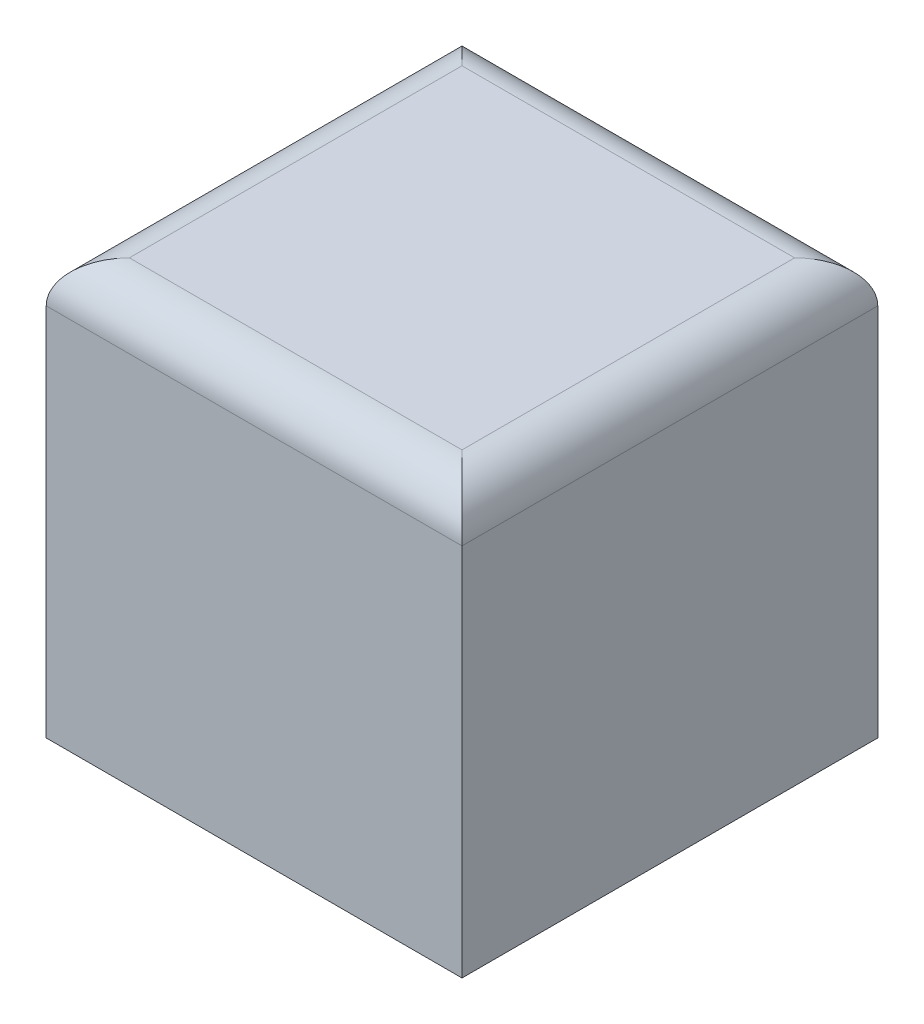
ISO-10303-21;
HEADER;
FILE_DESCRIPTION(('STEP AP214'),'2;1');
FILE_NAME('part.step','',(''),(''),'','','');
FILE_SCHEMA(('AUTOMOTIVE_DESIGN { 1 0 10303 214 1 1 1 1 }'));
ENDSEC;
DATA;
#1=APPLICATION_CONTEXT('core data for automotive mechanical design processes');
#2=APPLICATION_PROTOCOL_DEFINITION('international standard','automotive_design',2000,#1);
#3=PRODUCT_CONTEXT('',#1,'mechanical');
#4=PRODUCT('Part','Part','',(#3));
#5=PRODUCT_RELATED_PRODUCT_CATEGORY('part','',(#4));
#6=PRODUCT_DEFINITION_FORMATION('','',#4);
#7=PRODUCT_DEFINITION_CONTEXT('part definition',#1,'design');
#8=PRODUCT_DEFINITION('design','',#6,#7);
#9=PRODUCT_DEFINITION_SHAPE('','',#8);
#10=(LENGTH_UNIT() NAMED_UNIT(*) SI_UNIT(.MILLI.,.METRE.));
#11=(NAMED_UNIT(*) PLANE_ANGLE_UNIT() SI_UNIT($,.RADIAN.));
#12=(NAMED_UNIT(*) SI_UNIT($,.STERADIAN.) SOLID_ANGLE_UNIT());
#13=UNCERTAINTY_MEASURE_WITH_UNIT(LENGTH_MEASURE(1.E-05),#10,'distance_accuracy_value','');
#14=(GEOMETRIC_REPRESENTATION_CONTEXT(3) GLOBAL_UNCERTAINTY_ASSIGNED_CONTEXT((#13)) GLOBAL_UNIT_ASSIGNED_CONTEXT((#10,
#11,#12)) REPRESENTATION_CONTEXT('',''));
#15=CARTESIAN_POINT('',(0.,0.,0.));
#16=DIRECTION('',(0.,0.,1.));
#17=DIRECTION('',(1.,0.,0.));
#18=AXIS2_PLACEMENT_3D('',#15,#16,#17);
#19=CARTESIAN_POINT('',(-40.,40.,100.));
#20=DIRECTION('',(0.,0.,1.));
#21=DIRECTION('',(1.,0.,0.));
#22=AXIS2_PLACEMENT_3D('',#19,#20,#21);
#23=CYLINDRICAL_SURFACE('',#22,10.);
#24=CARTESIAN_POINT('',(-40.,40.,90.));
#25=DIRECTION('',(0.707106781186547,0.,0.707106781186547));
#26=DIRECTION('',(0.707106781186547,0.,-0.707106781186547));
#27=AXIS2_PLACEMENT_3D('',#24,#25,#26);
#28=ELLIPSE('',#27,14.1421356237309,10.);
#29=CARTESIAN_POINT('',(-40.,50.,90.));
#30=VERTEX_POINT('',#29);
#31=CARTESIAN_POINT('',(-50.,40.,100.));
#32=VERTEX_POINT('',#31);
#33=EDGE_CURVE('E11',#30,#32,#28,.T.);
#34=ORIENTED_EDGE('',*,*,#33,.F.);
#35=DIRECTION('',(0.,0.,1.));
#36=VECTOR('',#35,1.);
#37=CARTESIAN_POINT('',(-40.,50.,100.));
#38=LINE('',#37,#36);
#39=CARTESIAN_POINT('',(-40.,50.,10.));
#40=VERTEX_POINT('',#39);
#41=EDGE_CURVE('E112',#40,#30,#38,.T.);
#42=ORIENTED_EDGE('',*,*,#41,.F.);
#43=CARTESIAN_POINT('',(-40.,40.,9.99999999999999));
#44=DIRECTION('',(-0.707106781186547,0.,0.707106781186547));
#45=DIRECTION('',(0.707106781186547,0.,0.707106781186547));
#46=AXIS2_PLACEMENT_3D('',#43,#44,#45);
#47=ELLIPSE('',#46,14.1421356237309,10.);
#48=CARTESIAN_POINT('',(-50.,40.,0.));
#49=VERTEX_POINT('',#48);
#50=EDGE_CURVE('E48',#40,#49,#47,.T.);
#51=ORIENTED_EDGE('',*,*,#50,.T.);
#52=DIRECTION('',(0.,0.,1.));
#53=VECTOR('',#52,1.);
#54=CARTESIAN_POINT('',(-50.,40.,100.));
#55=LINE('',#54,#53);
#56=EDGE_CURVE('E145',#32,#49,#55,.F.);
#57=ORIENTED_EDGE('',*,*,#56,.F.);
#58=EDGE_LOOP('',(#34,#42,#51,#57));
#59=FACE_BOUND('',#58,.T.);
#60=ADVANCED_FACE('F41',(#59),#23,.T.);
#61=CARTESIAN_POINT('',(-50.,40.,9.99999999999999));
#62=DIRECTION('',(1.,0.,0.));
#63=DIRECTION('',(0.,0.,-1.));
#64=AXIS2_PLACEMENT_3D('',#61,#62,#63);
#65=CYLINDRICAL_SURFACE('',#64,10.);
#66=ORIENTED_EDGE('',*,*,#50,.F.);
#67=DIRECTION('',(-1.,0.,0.));
#68=VECTOR('',#67,1.);
#69=CARTESIAN_POINT('',(-50.,50.,9.99999999999999));
#70=LINE('',#69,#68);
#71=CARTESIAN_POINT('',(40.,50.,9.99999999999999));
#72=VERTEX_POINT('',#71);
#73=EDGE_CURVE('E130',#72,#40,#70,.T.);
#74=ORIENTED_EDGE('',*,*,#73,.F.);
#75=CARTESIAN_POINT('',(40.,40.,9.99999999999999));
#76=DIRECTION('',(0.707106781186547,0.,0.707106781186547));
#77=DIRECTION('',(0.707106781186547,0.,-0.707106781186547));
#78=AXIS2_PLACEMENT_3D('',#75,#76,#77);
#79=ELLIPSE('',#78,14.1421356237309,10.);
#80=CARTESIAN_POINT('',(50.,40.,0.));
#81=VERTEX_POINT('',#80);
#82=EDGE_CURVE('E62',#72,#81,#79,.F.);
#83=ORIENTED_EDGE('',*,*,#82,.T.);
#84=DIRECTION('',(-1.,0.,0.));
#85=VECTOR('',#84,1.);
#86=CARTESIAN_POINT('',(-50.,40.,0.));
#87=LINE('',#86,#85);
#88=EDGE_CURVE('E143',#49,#81,#87,.F.);
#89=ORIENTED_EDGE('',*,*,#88,.F.);
#90=EDGE_LOOP('',(#66,#74,#83,#89));
#91=FACE_BOUND('',#90,.T.);
#92=ADVANCED_FACE('F159',(#91),#65,.T.);
#93=CARTESIAN_POINT('',(40.,40.,100.));
#94=DIRECTION('',(0.,0.,-1.));
#95=DIRECTION('',(-1.,0.,0.));
#96=AXIS2_PLACEMENT_3D('',#93,#94,#95);
#97=CYLINDRICAL_SURFACE('',#96,10.);
#98=ORIENTED_EDGE('',*,*,#82,.F.);
#99=DIRECTION('',(0.,0.,-1.));
#100=VECTOR('',#99,1.);
#101=CARTESIAN_POINT('',(40.,50.,100.));
#102=LINE('',#101,#100);
#103=CARTESIAN_POINT('',(40.,50.,90.));
#104=VERTEX_POINT('',#103);
#105=EDGE_CURVE('E133',#104,#72,#102,.T.);
#106=ORIENTED_EDGE('',*,*,#105,.F.);
#107=CARTESIAN_POINT('',(40.,40.,90.));
#108=DIRECTION('',(0.707106781186547,0.,-0.707106781186547));
#109=DIRECTION('',(-0.707106781186547,0.,-0.707106781186547));
#110=AXIS2_PLACEMENT_3D('',#107,#108,#109);
#111=ELLIPSE('',#110,14.1421356237309,10.);
#112=CARTESIAN_POINT('',(50.,40.,100.));
#113=VERTEX_POINT('',#112);
#114=EDGE_CURVE('E147',#104,#113,#111,.T.);
#115=ORIENTED_EDGE('',*,*,#114,.T.);
#116=DIRECTION('',(0.,0.,-1.));
#117=VECTOR('',#116,1.);
#118=CARTESIAN_POINT('',(50.,40.,100.));
#119=LINE('',#118,#117);
#120=EDGE_CURVE('E140',#81,#113,#119,.F.);
#121=ORIENTED_EDGE('',*,*,#120,.F.);
#122=EDGE_LOOP('',(#98,#106,#115,#121));
#123=FACE_BOUND('',#122,.T.);
#124=ADVANCED_FACE('F152',(#123),#97,.T.);
#125=CARTESIAN_POINT('',(-50.,40.,90.));
#126=DIRECTION('',(1.,0.,0.));
#127=DIRECTION('',(0.,0.,-1.));
#128=AXIS2_PLACEMENT_3D('',#125,#126,#127);
#129=CYLINDRICAL_SURFACE('',#128,10.);
#130=DIRECTION('',(1.,0.,0.));
#131=VECTOR('',#130,1.);
#132=CARTESIAN_POINT('',(-50.,50.,90.));
#133=LINE('',#132,#131);
#134=EDGE_CURVE('E136',#30,#104,#133,.T.);
#135=ORIENTED_EDGE('',*,*,#134,.F.);
#136=ORIENTED_EDGE('',*,*,#33,.T.);
#137=DIRECTION('',(1.,0.,0.));
#138=VECTOR('',#137,1.);
#139=CARTESIAN_POINT('',(0.,40.,100.));
#140=LINE('',#139,#138);
#141=EDGE_CURVE('E101',#113,#32,#140,.F.);
#142=ORIENTED_EDGE('',*,*,#141,.F.);
#143=ORIENTED_EDGE('',*,*,#114,.F.);
#144=EDGE_LOOP('',(#135,#136,#142,#143));
#145=FACE_BOUND('',#144,.T.);
#146=ADVANCED_FACE('F158',(#145),#129,.T.);
#147=CARTESIAN_POINT('',(50.,-50.,100.));
#148=DIRECTION('',(-1.,0.,0.));
#149=DIRECTION('',(0.,0.,1.));
#150=AXIS2_PLACEMENT_3D('',#147,#148,#149);
#151=PLANE('',#150);
#152=DIRECTION('',(0.,1.,0.));
#153=VECTOR('',#152,1.);
#154=CARTESIAN_POINT('',(50.,-50.,0.));
#155=LINE('',#154,#153);
#156=CARTESIAN_POINT('',(50.,-50.,0.));
#157=VERTEX_POINT('',#156);
#158=EDGE_CURVE('E122',#157,#81,#155,.T.);
#159=ORIENTED_EDGE('',*,*,#158,.T.);
#160=ORIENTED_EDGE('',*,*,#120,.T.);
#161=DIRECTION('',(0.,1.,0.));
#162=VECTOR('',#161,1.);
#163=CARTESIAN_POINT('',(50.,-50.,100.));
#164=LINE('',#163,#162);
#165=CARTESIAN_POINT('',(50.,-50.,100.));
#166=VERTEX_POINT('',#165);
#167=EDGE_CURVE('E103',#166,#113,#164,.T.);
#168=ORIENTED_EDGE('',*,*,#167,.F.);
#169=DIRECTION('',(0.,0.,-1.));
#170=VECTOR('',#169,1.);
#171=CARTESIAN_POINT('',(50.,-50.,100.));
#172=LINE('',#171,#170);
#173=EDGE_CURVE('E113',#166,#157,#172,.T.);
#174=ORIENTED_EDGE('',*,*,#173,.T.);
#175=EDGE_LOOP('',(#159,#160,#168,#174));
#176=FACE_BOUND('',#175,.T.);
#177=ADVANCED_FACE('F156',(#176),#151,.F.);
#178=CARTESIAN_POINT('',(-50.,50.,100.));
#179=DIRECTION('',(0.,-1.,0.));
#180=DIRECTION('',(0.,0.,-1.));
#181=AXIS2_PLACEMENT_3D('',#178,#179,#180);
#182=PLANE('',#181);
#183=ORIENTED_EDGE('',*,*,#41,.T.);
#184=ORIENTED_EDGE('',*,*,#134,.T.);
#185=ORIENTED_EDGE('',*,*,#105,.T.);
#186=ORIENTED_EDGE('',*,*,#73,.T.);
#187=EDGE_LOOP('',(#183,#184,#185,#186));
#188=FACE_BOUND('',#187,.T.);
#189=ADVANCED_FACE('F183',(#188),#182,.F.);
#190=CARTESIAN_POINT('',(-50.,-50.,100.));
#191=DIRECTION('',(1.,0.,0.));
#192=DIRECTION('',(0.,0.,-1.));
#193=AXIS2_PLACEMENT_3D('',#190,#191,#192);
#194=PLANE('',#193);
#195=DIRECTION('',(0.,-1.,0.));
#196=VECTOR('',#195,1.);
#197=CARTESIAN_POINT('',(-50.,-50.,100.));
#198=LINE('',#197,#196);
#199=CARTESIAN_POINT('',(-50.,-50.,100.));
#200=VERTEX_POINT('',#199);
#201=EDGE_CURVE('E93',#32,#200,#198,.T.);
#202=ORIENTED_EDGE('',*,*,#201,.F.);
#203=ORIENTED_EDGE('',*,*,#56,.T.);
#204=DIRECTION('',(0.,-1.,0.));
#205=VECTOR('',#204,1.);
#206=CARTESIAN_POINT('',(-50.,-50.,0.));
#207=LINE('',#206,#205);
#208=CARTESIAN_POINT('',(-50.,-50.,0.));
#209=VERTEX_POINT('',#208);
#210=EDGE_CURVE('E109',#49,#209,#207,.T.);
#211=ORIENTED_EDGE('',*,*,#210,.T.);
#212=DIRECTION('',(0.,0.,-1.));
#213=VECTOR('',#212,1.);
#214=CARTESIAN_POINT('',(-50.,-50.,100.));
#215=LINE('',#214,#213);
#216=EDGE_CURVE('E106',#200,#209,#215,.T.);
#217=ORIENTED_EDGE('',*,*,#216,.F.);
#218=EDGE_LOOP('',(#202,#203,#211,#217));
#219=FACE_BOUND('',#218,.T.);
#220=ADVANCED_FACE('F107',(#219),#194,.F.);
#221=CARTESIAN_POINT('',(-50.,-50.,100.));
#222=DIRECTION('',(0.,1.,0.));
#223=DIRECTION('',(0.,0.,1.));
#224=AXIS2_PLACEMENT_3D('',#221,#222,#223);
#225=PLANE('',#224);
#226=DIRECTION('',(1.,0.,0.));
#227=VECTOR('',#226,1.);
#228=CARTESIAN_POINT('',(-50.,-50.,0.));
#229=LINE('',#228,#227);
#230=EDGE_CURVE('E126',#209,#157,#229,.T.);
#231=ORIENTED_EDGE('',*,*,#230,.T.);
#232=ORIENTED_EDGE('',*,*,#173,.F.);
#233=DIRECTION('',(1.,0.,0.));
#234=VECTOR('',#233,1.);
#235=CARTESIAN_POINT('',(-50.,-50.,100.));
#236=LINE('',#235,#234);
#237=EDGE_CURVE('E98',#200,#166,#236,.T.);
#238=ORIENTED_EDGE('',*,*,#237,.F.);
#239=ORIENTED_EDGE('',*,*,#216,.T.);
#240=EDGE_LOOP('',(#231,#232,#238,#239));
#241=FACE_BOUND('',#240,.T.);
#242=ADVANCED_FACE('F115',(#241),#225,.F.);
#243=CARTESIAN_POINT('',(0.,0.,100.));
#244=DIRECTION('',(0.,0.,-1.));
#245=DIRECTION('',(-1.,0.,0.));
#246=AXIS2_PLACEMENT_3D('',#243,#244,#245);
#247=PLANE('',#246);
#248=ORIENTED_EDGE('',*,*,#167,.T.);
#249=ORIENTED_EDGE('',*,*,#141,.T.);
#250=ORIENTED_EDGE('',*,*,#201,.T.);
#251=ORIENTED_EDGE('',*,*,#237,.T.);
#252=EDGE_LOOP('',(#248,#249,#250,#251));
#253=FACE_BOUND('',#252,.T.);
#254=ADVANCED_FACE('F96',(#253),#247,.F.);
#255=CARTESIAN_POINT('',(0.,0.,0.));
#256=DIRECTION('',(0.,0.,-1.));
#257=DIRECTION('',(-1.,0.,0.));
#258=AXIS2_PLACEMENT_3D('',#255,#256,#257);
#259=PLANE('',#258);
#260=ORIENTED_EDGE('',*,*,#210,.F.);
#261=ORIENTED_EDGE('',*,*,#88,.T.);
#262=ORIENTED_EDGE('',*,*,#158,.F.);
#263=ORIENTED_EDGE('',*,*,#230,.F.);
#264=EDGE_LOOP('',(#260,#261,#262,#263));
#265=FACE_BOUND('',#264,.T.);
#266=ADVANCED_FACE('F161',(#265),#259,.T.);
#267=CLOSED_SHELL('',(#60,#92,#124,#146,#177,#189,#220,#242,#254,#266));
#268=MANIFOLD_SOLID_BREP('B2',#267);
#269=ADVANCED_BREP_SHAPE_REPRESENTATION('',(#18,#268),#14);
#270=SHAPE_DEFINITION_REPRESENTATION(#9,#269);
ENDSEC;
END-ISO-10303-21;
